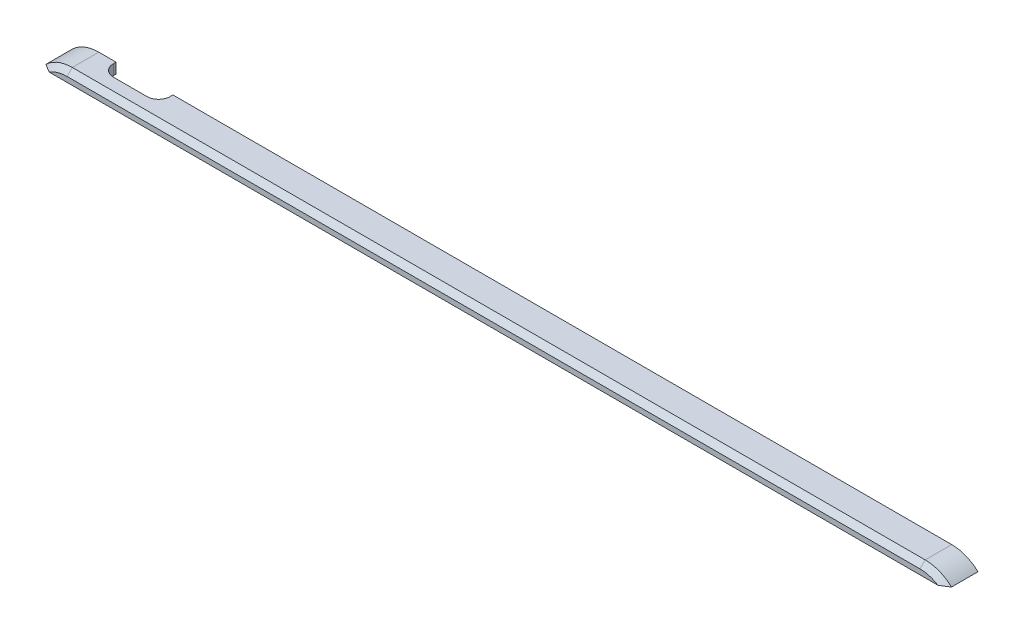
ISO-10303-21;
HEADER;
FILE_DESCRIPTION(('STEP AP214'),'2;1');
FILE_NAME('part.step','',(''),(''),'','','');
FILE_SCHEMA(('AUTOMOTIVE_DESIGN { 1 0 10303 214 1 1 1 1 }'));
ENDSEC;
DATA;
#1=APPLICATION_CONTEXT('core data for automotive mechanical design processes');
#2=APPLICATION_PROTOCOL_DEFINITION('international standard','automotive_design',2000,#1);
#3=PRODUCT_CONTEXT('',#1,'mechanical');
#4=PRODUCT('Part','Part','',(#3));
#5=PRODUCT_RELATED_PRODUCT_CATEGORY('part','',(#4));
#6=PRODUCT_DEFINITION_FORMATION('','',#4);
#7=PRODUCT_DEFINITION_CONTEXT('part definition',#1,'design');
#8=PRODUCT_DEFINITION('design','',#6,#7);
#9=PRODUCT_DEFINITION_SHAPE('','',#8);
#10=(LENGTH_UNIT() NAMED_UNIT(*) SI_UNIT(.MILLI.,.METRE.));
#11=(NAMED_UNIT(*) PLANE_ANGLE_UNIT() SI_UNIT($,.RADIAN.));
#12=(NAMED_UNIT(*) SI_UNIT($,.STERADIAN.) SOLID_ANGLE_UNIT());
#13=UNCERTAINTY_MEASURE_WITH_UNIT(LENGTH_MEASURE(1.E-05),#10,'distance_accuracy_value','');
#14=(GEOMETRIC_REPRESENTATION_CONTEXT(3) GLOBAL_UNCERTAINTY_ASSIGNED_CONTEXT((#13)) GLOBAL_UNIT_ASSIGNED_CONTEXT((#10,
#11,#12)) REPRESENTATION_CONTEXT('',''));
#15=CARTESIAN_POINT('',(0.,0.,0.));
#16=DIRECTION('',(0.,0.,1.));
#17=DIRECTION('',(1.,0.,0.));
#18=AXIS2_PLACEMENT_3D('',#15,#16,#17);
#19=CARTESIAN_POINT('',(149.811755103458,82.3491660064344,0.765));
#20=DIRECTION('',(0.,0.,1.));
#21=DIRECTION('',(1.,0.,0.));
#22=AXIS2_PLACEMENT_3D('',#19,#20,#21);
#23=PLANE('',#22);
#24=DIRECTION('',(0.,1.,0.));
#25=VECTOR('',#24,1.);
#26=CARTESIAN_POINT('',(146.86,82.3491660064344,0.765));
#27=LINE('',#26,#25);
#28=CARTESIAN_POINT('',(146.86,100.945,0.765));
#29=VERTEX_POINT('',#28);
#30=CARTESIAN_POINT('',(146.86,102.945000000004,0.765));
#31=VERTEX_POINT('',#30);
#32=EDGE_CURVE('E146',#29,#31,#27,.T.);
#33=ORIENTED_EDGE('',*,*,#32,.T.);
#34=DIRECTION('',(1.,1.50756392520579E-12,0.));
#35=VECTOR('',#34,1.);
#36=CARTESIAN_POINT('',(149.811755103476,102.945000000009,0.765));
#37=LINE('',#36,#35);
#38=CARTESIAN_POINT('',(153.3,102.945000000011,0.765));
#39=VERTEX_POINT('',#38);
#40=EDGE_CURVE('E150',#31,#39,#37,.T.);
#41=ORIENTED_EDGE('',*,*,#40,.T.);
#42=DIRECTION('',(0.,1.,0.));
#43=VECTOR('',#42,1.);
#44=CARTESIAN_POINT('',(153.3,82.3491660064344,0.765));
#45=LINE('',#44,#43);
#46=CARTESIAN_POINT('',(153.3,100.945000000002,0.765));
#47=VERTEX_POINT('',#46);
#48=EDGE_CURVE('E180',#47,#39,#45,.T.);
#49=ORIENTED_EDGE('',*,*,#48,.F.);
#50=DIRECTION('',(1.,3.05311352129674E-13,0.));
#51=VECTOR('',#50,1.);
#52=CARTESIAN_POINT('',(155.079999999998,100.945000000003,0.764999999999988));
#53=LINE('',#52,#51);
#54=EDGE_CURVE('E153',#29,#47,#53,.T.);
#55=ORIENTED_EDGE('',*,*,#54,.F.);
#56=EDGE_LOOP('',(#33,#41,#49,#55));
#57=FACE_BOUND('',#56,.T.);
#58=ADVANCED_FACE('F43',(#57),#23,.F.);
#59=CARTESIAN_POINT('',(305.329998695022,102.945000000001,2.9));
#60=DIRECTION('',(0.,1.,0.));
#61=DIRECTION('',(-1.,0.,0.));
#62=AXIS2_PLACEMENT_3D('',#59,#60,#61);
#63=PLANE('',#62);
#64=DIRECTION('',(0.,0.,1.));
#65=VECTOR('',#64,1.);
#66=CARTESIAN_POINT('',(141.29074746884,102.945000000001,2.9));
#67=LINE('',#66,#65);
#68=CARTESIAN_POINT('',(141.29074746884,102.945000000001,-2.));
#69=VERTEX_POINT('',#68);
#70=CARTESIAN_POINT('',(141.29074746884,102.945000000001,3.10000000000002));
#71=VERTEX_POINT('',#70);
#72=EDGE_CURVE('E196',#69,#71,#67,.T.);
#73=ORIENTED_EDGE('',*,*,#72,.T.);
#74=DIRECTION('',(1.,0.,0.));
#75=VECTOR('',#74,1.);
#76=CARTESIAN_POINT('',(305.329998695022,102.945000000001,3.10000000000002));
#77=LINE('',#76,#75);
#78=CARTESIAN_POINT('',(305.329998695022,102.945000000002,3.10000000000002));
#79=VERTEX_POINT('',#78);
#80=EDGE_CURVE('E211',#71,#79,#77,.T.);
#81=ORIENTED_EDGE('',*,*,#80,.T.);
#82=DIRECTION('',(0.,0.,1.));
#83=VECTOR('',#82,1.);
#84=CARTESIAN_POINT('',(305.329998695022,102.945000000002,2.9));
#85=LINE('',#84,#83);
#86=CARTESIAN_POINT('',(305.329998695022,102.945000000001,-2.));
#87=VERTEX_POINT('',#86);
#88=EDGE_CURVE('E195',#87,#79,#85,.T.);
#89=ORIENTED_EDGE('',*,*,#88,.F.);
#90=DIRECTION('',(-1.,0.,0.));
#91=VECTOR('',#90,1.);
#92=CARTESIAN_POINT('',(0.,102.945000000001,-2.));
#93=LINE('',#92,#91);
#94=CARTESIAN_POINT('',(155.55,102.945000000017,-2.));
#95=VERTEX_POINT('',#94);
#96=EDGE_CURVE('E192',#87,#95,#93,.T.);
#97=ORIENTED_EDGE('',*,*,#96,.T.);
#98=DIRECTION('',(0.,0.,-1.));
#99=VECTOR('',#98,1.);
#100=CARTESIAN_POINT('',(155.55,102.945000000017,-1.485));
#101=LINE('',#100,#99);
#102=CARTESIAN_POINT('',(155.55,102.945000000017,-1.485));
#103=VERTEX_POINT('',#102);
#104=EDGE_CURVE('E174',#103,#95,#101,.T.);
#105=ORIENTED_EDGE('',*,*,#104,.F.);
#106=CARTESIAN_POINT('',(153.3,102.945000000014,-1.485));
#107=DIRECTION('',(-1.50756392520579E-12,1.,0.));
#108=DIRECTION('',(-1.,-1.50756392520579E-12,0.));
#109=AXIS2_PLACEMENT_3D('',#106,#107,#108);
#110=CIRCLE('',#109,2.25);
#111=EDGE_CURVE('E172',#39,#103,#110,.T.);
#112=ORIENTED_EDGE('',*,*,#111,.F.);
#113=ORIENTED_EDGE('',*,*,#40,.F.);
#114=CARTESIAN_POINT('',(146.86,102.945000000004,-1.485));
#115=DIRECTION('',(-1.50756392520579E-12,1.,0.));
#116=DIRECTION('',(-1.,-1.50756392520579E-12,0.));
#117=AXIS2_PLACEMENT_3D('',#114,#115,#116);
#118=CIRCLE('',#117,2.25);
#119=CARTESIAN_POINT('',(144.61,102.945000000001,-1.485));
#120=VERTEX_POINT('',#119);
#121=EDGE_CURVE('E160',#120,#31,#118,.T.);
#122=ORIENTED_EDGE('',*,*,#121,.F.);
#123=DIRECTION('',(0.,0.,1.));
#124=VECTOR('',#123,1.);
#125=CARTESIAN_POINT('',(144.61,102.945000000001,-2.145));
#126=LINE('',#125,#124);
#127=CARTESIAN_POINT('',(144.61,102.945000000001,-2.));
#128=VERTEX_POINT('',#127);
#129=EDGE_CURVE('E178',#128,#120,#126,.T.);
#130=ORIENTED_EDGE('',*,*,#129,.F.);
#131=EDGE_CURVE('E191',#128,#69,#93,.T.);
#132=ORIENTED_EDGE('',*,*,#131,.T.);
#133=EDGE_LOOP('',(#73,#81,#89,#97,#105,#112,#113,#122,#130,#132));
#134=FACE_BOUND('',#133,.T.);
#135=ADVANCED_FACE('F169',(#134),#63,.T.);
#136=CARTESIAN_POINT('',(0.,0.,-2.));
#137=DIRECTION('',(0.,0.,-1.));
#138=DIRECTION('',(-1.,0.,0.));
#139=AXIS2_PLACEMENT_3D('',#136,#137,#138);
#140=PLANE('',#139);
#141=DIRECTION('',(1.,0.,0.));
#142=VECTOR('',#141,1.);
#143=CARTESIAN_POINT('',(0.,100.945000000001,-2.));
#144=LINE('',#143,#142);
#145=CARTESIAN_POINT('',(136.231103891899,100.945000000001,-2.));
#146=VERTEX_POINT('',#145);
#147=CARTESIAN_POINT('',(144.61,100.945000000001,-2.));
#148=VERTEX_POINT('',#147);
#149=EDGE_CURVE('E266',#146,#148,#144,.T.);
#150=ORIENTED_EDGE('',*,*,#149,.F.);
#151=CARTESIAN_POINT('',(141.29074693768,95.545003062316,-2.));
#152=DIRECTION('',(0.,0.,-1.));
#153=DIRECTION('',(-1.,0.,0.));
#154=AXIS2_PLACEMENT_3D('',#151,#152,#153);
#155=CIRCLE('',#154,7.39999693768338);
#156=EDGE_CURVE('E189',#69,#146,#155,.F.);
#157=ORIENTED_EDGE('',*,*,#156,.F.);
#158=ORIENTED_EDGE('',*,*,#131,.F.);
#159=DIRECTION('',(0.,1.,0.));
#160=VECTOR('',#159,1.);
#161=CARTESIAN_POINT('',(144.61,0.,-2.));
#162=LINE('',#161,#160);
#163=EDGE_CURVE('E182',#148,#128,#162,.T.);
#164=ORIENTED_EDGE('',*,*,#163,.F.);
#165=EDGE_LOOP('',(#150,#157,#158,#164));
#166=FACE_BOUND('',#165,.T.);
#167=ADVANCED_FACE('F303',(#166),#140,.T.);
#168=CARTESIAN_POINT('',(146.86,82.3491660064344,-1.485));
#169=DIRECTION('',(0.,1.,0.));
#170=DIRECTION('',(0.,0.,1.));
#171=AXIS2_PLACEMENT_3D('',#168,#169,#170);
#172=CYLINDRICAL_SURFACE('',#171,2.25);
#173=CARTESIAN_POINT('',(146.86,100.945000000001,-1.485));
#174=DIRECTION('',(-3.05311352129674E-13,1.,0.));
#175=DIRECTION('',(-1.,-3.05311352129674E-13,0.));
#176=AXIS2_PLACEMENT_3D('',#173,#174,#175);
#177=CIRCLE('',#176,2.25);
#178=CARTESIAN_POINT('',(144.61,100.945000000001,-1.485));
#179=VERTEX_POINT('',#178);
#180=EDGE_CURVE('E166',#179,#29,#177,.T.);
#181=ORIENTED_EDGE('',*,*,#180,.F.);
#182=DIRECTION('',(0.,1.,0.));
#183=VECTOR('',#182,1.);
#184=CARTESIAN_POINT('',(144.61,82.3491660064344,-1.485));
#185=LINE('',#184,#183);
#186=EDGE_CURVE('E156',#179,#120,#185,.T.);
#187=ORIENTED_EDGE('',*,*,#186,.T.);
#188=ORIENTED_EDGE('',*,*,#121,.T.);
#189=ORIENTED_EDGE('',*,*,#32,.F.);
#190=EDGE_LOOP('',(#181,#187,#188,#189));
#191=FACE_BOUND('',#190,.T.);
#192=ADVANCED_FACE('F161',(#191),#172,.F.);
#193=CARTESIAN_POINT('',(144.61,82.3491660064344,-2.145));
#194=DIRECTION('',(-1.,0.,0.));
#195=DIRECTION('',(0.,0.,1.));
#196=AXIS2_PLACEMENT_3D('',#193,#194,#195);
#197=PLANE('',#196);
#198=ORIENTED_EDGE('',*,*,#186,.F.);
#199=DIRECTION('',(0.,0.,-1.));
#200=VECTOR('',#199,1.);
#201=CARTESIAN_POINT('',(144.61,100.945000000001,-2.145));
#202=LINE('',#201,#200);
#203=EDGE_CURVE('E260',#179,#148,#202,.T.);
#204=ORIENTED_EDGE('',*,*,#203,.T.);
#205=ORIENTED_EDGE('',*,*,#163,.T.);
#206=ORIENTED_EDGE('',*,*,#129,.T.);
#207=EDGE_LOOP('',(#198,#204,#205,#206));
#208=FACE_BOUND('',#207,.T.);
#209=ADVANCED_FACE('F291',(#208),#197,.F.);
#210=CARTESIAN_POINT('',(153.3,82.3491660064344,-1.485));
#211=DIRECTION('',(0.,1.,0.));
#212=DIRECTION('',(0.,0.,1.));
#213=AXIS2_PLACEMENT_3D('',#210,#211,#212);
#214=CYLINDRICAL_SURFACE('',#213,2.25);
#215=DIRECTION('',(0.,1.,0.));
#216=VECTOR('',#215,1.);
#217=CARTESIAN_POINT('',(155.55,82.3491660064344,-1.485));
#218=LINE('',#217,#216);
#219=CARTESIAN_POINT('',(155.55,100.945000000001,-1.485));
#220=VERTEX_POINT('',#219);
#221=EDGE_CURVE('E335',#220,#103,#218,.T.);
#222=ORIENTED_EDGE('',*,*,#221,.F.);
#223=CARTESIAN_POINT('',(153.3,100.945000000003,-1.485));
#224=DIRECTION('',(-3.05311352129674E-13,1.,0.));
#225=DIRECTION('',(-1.,-3.05311352129674E-13,0.));
#226=AXIS2_PLACEMENT_3D('',#223,#224,#225);
#227=CIRCLE('',#226,2.25);
#228=EDGE_CURVE('E201',#47,#220,#227,.T.);
#229=ORIENTED_EDGE('',*,*,#228,.F.);
#230=ORIENTED_EDGE('',*,*,#48,.T.);
#231=ORIENTED_EDGE('',*,*,#111,.T.);
#232=EDGE_LOOP('',(#222,#229,#230,#231));
#233=FACE_BOUND('',#232,.T.);
#234=ADVANCED_FACE('F284',(#233),#214,.F.);
#235=CARTESIAN_POINT('',(223.310489012841,99.9450000000011,1.00857997860453));
#236=DIRECTION('',(0.,0.,-1.));
#237=DIRECTION('',(-1.,0.,0.));
#238=AXIS2_PLACEMENT_3D('',#235,#236,#237);
#239=CONICAL_SURFACE('',#238,1.65000000000001,1.02974425867666);
#240=CARTESIAN_POINT('',(223.310489012841,99.9450000000011,1.00857997860453));
#241=DIRECTION('',(0.,0.,-1.));
#242=DIRECTION('',(-1.,0.,0.));
#243=AXIS2_PLACEMENT_3D('',#240,#241,#242);
#244=CIRCLE('',#243,1.65000000000001);
#245=CARTESIAN_POINT('',(221.998048538001,100.945000000001,1.00857997860453));
#246=VERTEX_POINT('',#245);
#247=CARTESIAN_POINT('',(224.622929487682,100.945000000001,1.00857997860453));
#248=VERTEX_POINT('',#247);
#249=EDGE_CURVE('E157',#246,#248,#244,.T.);
#250=ORIENTED_EDGE('',*,*,#249,.T.);
#251=CARTESIAN_POINT('',(214.694187991071,100.945000000001,-3.21194700188258));
#252=CARTESIAN_POINT('',(214.970886690454,100.945000000001,-3.04680463875739));
#253=CARTESIAN_POINT('',(215.247626545812,100.945000000001,-2.88173113505485));
#254=CARTESIAN_POINT('',(215.801267148884,100.945000000001,-2.55177695549593));
#255=CARTESIAN_POINT('',(216.078167912161,100.945000000001,-2.38689630575886));
#256=CARTESIAN_POINT('',(216.632891741382,100.945000000001,-2.05697702486592));
#257=CARTESIAN_POINT('',(216.910715273147,100.945000000001,-1.89193917651968));
#258=CARTESIAN_POINT('',(217.466582232382,100.945000000001,-1.56231046001289));
#259=CARTESIAN_POINT('',(217.744625629426,100.945000000001,-1.39771954053712));
#260=CARTESIAN_POINT('',(218.35013173903,100.945000000001,-1.04022112088084));
#261=CARTESIAN_POINT('',(218.67766687962,100.945000000001,-0.847436033685756));
#262=CARTESIAN_POINT('',(219.169748414202,100.945000000001,-0.559439899633264));
#263=CARTESIAN_POINT('',(219.333937895368,100.945000000001,-0.463619299709885));
#264=CARTESIAN_POINT('',(219.662652374727,100.945000000001,-0.272568574002124));
#265=CARTESIAN_POINT('',(219.827177360271,100.945000000001,-0.177338426481848));
#266=CARTESIAN_POINT('',(220.156417439291,100.945000000001,0.0120758789763789));
#267=CARTESIAN_POINT('',(220.321131595,100.945000000001,0.106261665829728));
#268=CARTESIAN_POINT('',(220.651346503488,100.945000000001,0.293306929038242));
#269=CARTESIAN_POINT('',(220.816847366243,100.945000000001,0.386166212227427));
#270=CARTESIAN_POINT('',(221.065992469824,100.945000000001,0.523702127512906));
#271=CARTESIAN_POINT('',(221.149160846966,100.945000000001,0.569239796067037));
#272=CARTESIAN_POINT('',(221.315921664274,100.945000000001,0.659530870143676));
#273=CARTESIAN_POINT('',(221.399514097407,100.945000000001,0.704284288618714));
#274=CARTESIAN_POINT('',(221.567252170647,100.945000000001,0.792695696160076));
#275=CARTESIAN_POINT('',(221.651397675227,100.945000000001,0.836353941824392));
#276=CARTESIAN_POINT('',(221.820474859997,100.945000000001,0.922116582190598));
#277=CARTESIAN_POINT('',(221.90540647142,100.945000000001,0.964221111231647));
#278=CARTESIAN_POINT('',(222.026543176841,100.945000000001,1.02222791028813));
#279=CARTESIAN_POINT('',(222.062286488905,100.945000000001,1.03909431129302));
#280=CARTESIAN_POINT('',(222.134002238529,100.945000000001,1.07233679807991));
#281=CARTESIAN_POINT('',(222.169974683346,100.945000000001,1.08871286823364));
#282=CARTESIAN_POINT('',(222.242193868846,100.945000000001,1.12087983781569));
#283=CARTESIAN_POINT('',(222.278440686143,100.945000000001,1.13667056594312));
#284=CARTESIAN_POINT('',(222.35123894946,100.945000000001,1.167532006739));
#285=CARTESIAN_POINT('',(222.387790394306,100.945000000001,1.18260272217775));
#286=CARTESIAN_POINT('',(222.497260608641,100.945000000001,1.2262284003639));
#287=CARTESIAN_POINT('',(222.570695060313,100.945000000001,1.25351477686742));
#288=CARTESIAN_POINT('',(222.719289617091,100.945000000001,1.30297548277343));
#289=CARTESIAN_POINT('',(222.794448884473,100.945000000001,1.32515223840304));
#290=CARTESIAN_POINT('',(222.923062443324,100.945000000001,1.35626622663656));
#291=CARTESIAN_POINT('',(222.976031220133,100.945000000001,1.36717670186032));
#292=CARTESIAN_POINT('',(223.082694533336,100.945000000001,1.38451781195559));
#293=CARTESIAN_POINT('',(223.136388714203,100.945000000001,1.39095056561359));
#294=CARTESIAN_POINT('',(223.243901790447,100.945000000001,1.39865745903534));
#295=CARTESIAN_POINT('',(223.297718871007,100.945000000001,1.39995604486939));
#296=CARTESIAN_POINT('',(223.405227639647,100.945000000001,1.39731387036754));
#297=CARTESIAN_POINT('',(223.458919300861,100.945000000001,1.39337207511463));
#298=CARTESIAN_POINT('',(223.58416122155,100.945000000001,1.37848210940148));
#299=CARTESIAN_POINT('',(223.655476478806,100.945000000001,1.36558466903972));
#300=CARTESIAN_POINT('',(223.796553533905,100.945000000001,1.33307727023198));
#301=CARTESIAN_POINT('',(223.866313706805,100.945000000001,1.31346061150743));
#302=CARTESIAN_POINT('',(224.005910385357,100.945000000001,1.26901574456081));
#303=CARTESIAN_POINT('',(224.075710793637,100.945000000001,1.24407675174826));
#304=CARTESIAN_POINT('',(224.179406605398,100.945000000001,1.20415560008459));
#305=CARTESIAN_POINT('',(224.213799383491,100.945000000001,1.19043199375118));
#306=CARTESIAN_POINT('',(224.282295449047,100.945000000001,1.16228223227698));
#307=CARTESIAN_POINT('',(224.316398747383,100.945000000001,1.14785610365813));
#308=CARTESIAN_POINT('',(224.432957768475,100.945000000001,1.09738004959701));
#309=CARTESIAN_POINT('',(224.51479999325,100.945000000001,1.05991592201944));
#310=CARTESIAN_POINT('',(224.677438596456,100.945000000001,0.982773727446175));
#311=CARTESIAN_POINT('',(224.758234766822,100.945000000001,0.943095228089168));
#312=CARTESIAN_POINT('',(224.919110653249,100.945000000001,0.862209920285997));
#313=CARTESIAN_POINT('',(224.999189958218,100.945000000001,0.821002296930696));
#314=CARTESIAN_POINT('',(225.158792283646,100.945000000001,0.737521346018975));
#315=CARTESIAN_POINT('',(225.238315284432,100.945000000001,0.695247981017635));
#316=CARTESIAN_POINT('',(225.476589240269,100.945000000001,0.567113754658055));
#317=CARTESIAN_POINT('',(225.634721645887,100.945000000001,0.480104793786229));
#318=CARTESIAN_POINT('',(225.949968565067,100.945000000001,0.304395983185692));
#319=CARTESIAN_POINT('',(226.107083397597,100.945000000001,0.215696701469319));
#320=CARTESIAN_POINT('',(226.397633341943,100.945000000001,0.0503365205529457));
#321=CARTESIAN_POINT('',(226.531152760848,100.945000000001,-0.0261763718179388));
#322=CARTESIAN_POINT('',(226.797885026475,100.945000000001,-0.179764945916014));
#323=CARTESIAN_POINT('',(226.931097840904,100.945000000001,-0.256840683652189));
#324=CARTESIAN_POINT('',(227.196805313119,100.945000000001,-0.411112588253136));
#325=CARTESIAN_POINT('',(227.329300819586,100.945000000001,-0.488307294466906));
#326=CARTESIAN_POINT('',(227.594099063033,100.945000000001,-0.642993446395089));
#327=CARTESIAN_POINT('',(227.726401819557,100.945000000001,-0.720484858644653));
#328=CARTESIAN_POINT('',(227.858642226062,100.945000000001,-0.798082015417644));
#329=B_SPLINE_CURVE_WITH_KNOTS('',3,(#251,#252,#253,#254,#255,#256,#257,#258,#259,#260,#261,
#262,#263,#264,#265,#266,#267,#268,#269,#270,#271,#272,#273,#274,#275,#276,#277,#278,#279,#280,
#281,#282,#283,#284,#285,#286,#287,#288,#289,#290,#291,#292,#293,#294,#295,#296,#297,#298,#299,
#300,#301,#302,#303,#304,#305,#306,#307,#308,#309,#310,#311,#312,#313,#314,#315,#316,#317,#318,
#319,#320,#321,#322,#323,#324,#325,#326,#327,#328),.UNSPECIFIED.,.F.,.F.,(4,2,2,2,2,2,2,2,2,2,2,
2,2,2,2,2,2,2,2,2,2,2,2,2,2,2,2,2,2,2,2,2,2,2,2,2,2,2,4),(0.,0.966699356322777,1.93351721938047,
2.90295521050736,3.87227674022051,5.01245253688786,5.58276571622721,6.15305777488708,
6.72227848313687,7.29158125347397,7.57603567184666,7.86048538778627,8.14486782286904,
8.42922561147442,8.54779138509503,8.66636093373519,8.78496491223668,8.90356843436625,
9.13847158500371,9.37326296445707,9.53535161661302,9.69736351876831,9.85860307402816,
10.0198744770387,10.236831277935,10.4540050569797,10.6762392466034,10.7873234005024,
10.8984033639492,11.1683719975873,11.4383935289232,11.7085610886557,11.9787381540134,
12.5201829272061,13.0614488552324,13.5231122245766,13.9848221778653,14.4448507847009,
14.9048289505118),.UNSPECIFIED.);
#330=EDGE_CURVE('E262',#248,#246,#329,.F.);
#331=ORIENTED_EDGE('',*,*,#330,.T.);
#332=EDGE_LOOP('',(#250,#331));
#333=FACE_BOUND('',#332,.T.);
#334=ADVANCED_FACE('F278',(#333),#239,.F.);
#335=DIRECTION('',(1.,0.,0.));
#336=VECTOR('',#335,1.);
#337=CARTESIAN_POINT('',(0.,100.945000000001,-2.));
#338=LINE('',#337,#336);
#339=CARTESIAN_POINT('',(155.55,100.945000000001,-2.));
#340=VERTEX_POINT('',#339);
#341=CARTESIAN_POINT('',(221.998048538001,100.945000000001,-2.));
#342=VERTEX_POINT('',#341);
#343=EDGE_CURVE('E270',#340,#342,#338,.T.);
#344=ORIENTED_EDGE('',*,*,#343,.F.);
#345=DIRECTION('',(0.,-1.,0.));
#346=VECTOR('',#345,1.);
#347=CARTESIAN_POINT('',(155.55,0.,-2.));
#348=LINE('',#347,#346);
#349=EDGE_CURVE('E184',#95,#340,#348,.T.);
#350=ORIENTED_EDGE('',*,*,#349,.F.);
#351=ORIENTED_EDGE('',*,*,#96,.F.);
#352=CARTESIAN_POINT('',(305.33000306231,95.545003062316,-2.));
#353=DIRECTION('',(0.,0.,-1.));
#354=DIRECTION('',(-1.,0.,0.));
#355=AXIS2_PLACEMENT_3D('',#352,#353,#354);
#356=CIRCLE('',#355,7.39999693768695);
#357=CARTESIAN_POINT('',(310.389646108096,100.945000000001,-2.));
#358=VERTEX_POINT('',#357);
#359=EDGE_CURVE('E187',#358,#87,#356,.F.);
#360=ORIENTED_EDGE('',*,*,#359,.F.);
#361=CARTESIAN_POINT('',(224.622929487682,100.945000000001,-2.));
#362=VERTEX_POINT('',#361);
#363=EDGE_CURVE('E267',#362,#358,#338,.T.);
#364=ORIENTED_EDGE('',*,*,#363,.F.);
#365=CARTESIAN_POINT('',(223.310489012841,99.9450000000011,-2.));
#366=DIRECTION('',(0.,0.,-1.));
#367=DIRECTION('',(-1.,0.,0.));
#368=AXIS2_PLACEMENT_3D('',#365,#366,#367);
#369=CIRCLE('',#368,1.64999999999998);
#370=EDGE_CURVE('E223',#342,#362,#369,.T.);
#371=ORIENTED_EDGE('',*,*,#370,.F.);
#372=EDGE_LOOP('',(#344,#350,#351,#360,#364,#371));
#373=FACE_BOUND('',#372,.T.);
#374=ADVANCED_FACE('F283',(#373),#140,.T.);
#375=CARTESIAN_POINT('',(223.310489012841,99.9450000000011,-2.));
#376=DIRECTION('',(0.,0.,-1.));
#377=DIRECTION('',(-1.,0.,0.));
#378=AXIS2_PLACEMENT_3D('',#375,#376,#377);
#379=CYLINDRICAL_SURFACE('',#378,1.65);
#380=ORIENTED_EDGE('',*,*,#370,.T.);
#381=DIRECTION('',(0.,0.,-1.));
#382=VECTOR('',#381,1.);
#383=CARTESIAN_POINT('',(224.622929487682,100.945000000001,-2.));
#384=LINE('',#383,#382);
#385=EDGE_CURVE('E271',#362,#248,#384,.F.);
#386=ORIENTED_EDGE('',*,*,#385,.T.);
#387=ORIENTED_EDGE('',*,*,#249,.F.);
#388=DIRECTION('',(0.,0.,-1.));
#389=VECTOR('',#388,1.);
#390=CARTESIAN_POINT('',(221.998048538001,100.945000000001,-2.));
#391=LINE('',#390,#389);
#392=EDGE_CURVE('E219',#246,#342,#391,.T.);
#393=ORIENTED_EDGE('',*,*,#392,.T.);
#394=EDGE_LOOP('',(#380,#386,#387,#393));
#395=FACE_BOUND('',#394,.T.);
#396=ADVANCED_FACE('F286',(#395),#379,.F.);
#397=CARTESIAN_POINT('',(155.55,82.3491660064344,-1.485));
#398=DIRECTION('',(1.,0.,0.));
#399=DIRECTION('',(0.,0.,-1.));
#400=AXIS2_PLACEMENT_3D('',#397,#398,#399);
#401=PLANE('',#400);
#402=ORIENTED_EDGE('',*,*,#349,.T.);
#403=DIRECTION('',(0.,0.,1.));
#404=VECTOR('',#403,1.);
#405=CARTESIAN_POINT('',(155.55,100.945000000001,-1.485));
#406=LINE('',#405,#404);
#407=EDGE_CURVE('E47',#340,#220,#406,.T.);
#408=ORIENTED_EDGE('',*,*,#407,.T.);
#409=ORIENTED_EDGE('',*,*,#221,.T.);
#410=ORIENTED_EDGE('',*,*,#104,.T.);
#411=EDGE_LOOP('',(#402,#408,#409,#410));
#412=FACE_BOUND('',#411,.T.);
#413=ADVANCED_FACE('F293',(#412),#401,.F.);
#414=CARTESIAN_POINT('',(141.29074693768,95.545003062316,2.9));
#415=DIRECTION('',(0.,0.,1.));
#416=DIRECTION('',(1.,0.,0.));
#417=AXIS2_PLACEMENT_3D('',#414,#415,#416);
#418=CYLINDRICAL_SURFACE('',#417,7.39999693768338);
#419=DIRECTION('',(0.,0.,1.));
#420=VECTOR('',#419,1.);
#421=CARTESIAN_POINT('',(136.231103891899,100.945000000001,2.9));
#422=LINE('',#421,#420);
#423=CARTESIAN_POINT('',(136.231103891899,100.945000000001,3.10000000000002));
#424=VERTEX_POINT('',#423);
#425=EDGE_CURVE('E66',#424,#146,#422,.F.);
#426=ORIENTED_EDGE('',*,*,#425,.F.);
#427=CARTESIAN_POINT('',(141.29074693768,95.545003062316,3.10000000000002));
#428=DIRECTION('',(0.,0.,1.));
#429=DIRECTION('',(1.,0.,0.));
#430=AXIS2_PLACEMENT_3D('',#427,#428,#429);
#431=CIRCLE('',#430,7.39999693768338);
#432=EDGE_CURVE('E214',#424,#71,#431,.F.);
#433=ORIENTED_EDGE('',*,*,#432,.T.);
#434=ORIENTED_EDGE('',*,*,#72,.F.);
#435=ORIENTED_EDGE('',*,*,#156,.T.);
#436=EDGE_LOOP('',(#426,#433,#434,#435));
#437=FACE_BOUND('',#436,.T.);
#438=ADVANCED_FACE('F296',(#437),#418,.T.);
#439=CARTESIAN_POINT('',(141.29074693768,101.945000000001,4.1));
#440=DIRECTION('',(0.,-0.70710678118654,-0.707106781186555));
#441=DIRECTION('',(-1.,0.,0.));
#442=AXIS2_PLACEMENT_3D('',#439,#440,#441);
#443=PLANE('',#442);
#444=DIRECTION('',(0.,0.707106781186621,-0.707106781186474));
#445=VECTOR('',#444,1.);
#446=CARTESIAN_POINT('',(305.329998695022,101.945000000001,4.1));
#447=LINE('',#446,#445);
#448=CARTESIAN_POINT('',(305.329998695022,101.945000000001,4.1));
#449=VERTEX_POINT('',#448);
#450=EDGE_CURVE('E222',#449,#79,#447,.T.);
#451=ORIENTED_EDGE('',*,*,#450,.T.);
#452=ORIENTED_EDGE('',*,*,#80,.F.);
#453=DIRECTION('',(0.,-0.707106781186552,0.707106781186543));
#454=VECTOR('',#453,1.);
#455=CARTESIAN_POINT('',(141.29074746884,102.944999999999,3.10000000000002));
#456=LINE('',#455,#454);
#457=CARTESIAN_POINT('',(141.29074746884,101.944999999999,4.1));
#458=VERTEX_POINT('',#457);
#459=EDGE_CURVE('E220',#71,#458,#456,.T.);
#460=ORIENTED_EDGE('',*,*,#459,.T.);
#461=DIRECTION('',(-1.,0.,0.));
#462=VECTOR('',#461,1.);
#463=CARTESIAN_POINT('',(141.29074693768,101.945000000001,4.1));
#464=LINE('',#463,#462);
#465=EDGE_CURVE('E208',#449,#458,#464,.T.);
#466=ORIENTED_EDGE('',*,*,#465,.F.);
#467=EDGE_LOOP('',(#451,#452,#460,#466));
#468=FACE_BOUND('',#467,.T.);
#469=ADVANCED_FACE('F242',(#468),#443,.F.);
#470=CARTESIAN_POINT('',(141.29074693768,95.545003062316,4.1));
#471=DIRECTION('',(0.,0.,1.));
#472=DIRECTION('',(1.,0.,0.));
#473=AXIS2_PLACEMENT_3D('',#470,#471,#472);
#474=PLANE('',#473);
#475=DIRECTION('',(-1.,0.,0.));
#476=VECTOR('',#475,1.);
#477=CARTESIAN_POINT('',(141.29074693768,100.945000000001,4.1));
#478=LINE('',#477,#476);
#479=CARTESIAN_POINT('',(308.765114978303,100.945000000001,4.1));
#480=VERTEX_POINT('',#479);
#481=CARTESIAN_POINT('',(137.855635021694,100.945000000001,4.1));
#482=VERTEX_POINT('',#481);
#483=EDGE_CURVE('E259',#480,#482,#478,.T.);
#484=ORIENTED_EDGE('',*,*,#483,.F.);
#485=CARTESIAN_POINT('',(305.33000306231,95.545003062316,4.1));
#486=DIRECTION('',(0.,0.,1.));
#487=DIRECTION('',(1.,0.,0.));
#488=AXIS2_PLACEMENT_3D('',#485,#486,#487);
#489=CIRCLE('',#488,6.39999693768697);
#490=EDGE_CURVE('E203',#480,#449,#489,.T.);
#491=ORIENTED_EDGE('',*,*,#490,.T.);
#492=ORIENTED_EDGE('',*,*,#465,.T.);
#493=CARTESIAN_POINT('',(141.29074693768,95.545003062316,4.1));
#494=DIRECTION('',(0.,0.,1.));
#495=DIRECTION('',(1.,0.,0.));
#496=AXIS2_PLACEMENT_3D('',#493,#494,#495);
#497=CIRCLE('',#496,6.3999969376834);
#498=EDGE_CURVE('E205',#458,#482,#497,.T.);
#499=ORIENTED_EDGE('',*,*,#498,.T.);
#500=EDGE_LOOP('',(#484,#491,#492,#499));
#501=FACE_BOUND('',#500,.T.);
#502=ADVANCED_FACE('F241',(#501),#474,.T.);
#503=CARTESIAN_POINT('',(141.29074693768,95.545003062316,4.1));
#504=DIRECTION('',(0.,0.,-1.));
#505=DIRECTION('',(-1.,0.,0.));
#506=AXIS2_PLACEMENT_3D('',#503,#504,#505);
#507=CONICAL_SURFACE('',#506,6.3999969376834,0.785398163397455);
#508=CARTESIAN_POINT('',(145.771303092448,100.945000000001,3.48320633349407));
#509=CARTESIAN_POINT('',(145.663385284355,100.945000000001,3.55210626497247));
#510=CARTESIAN_POINT('',(145.554801705982,100.945000000001,3.61997786549331));
#511=CARTESIAN_POINT('',(145.33613746665,100.945000000001,3.75332349725623));
#512=CARTESIAN_POINT('',(145.226056446579,100.945000000001,3.81879693896409));
#513=CARTESIAN_POINT('',(145.003782104916,100.945000000001,3.94726162303721));
#514=CARTESIAN_POINT('',(144.89158147422,100.945000000001,4.01024027928303));
#515=CARTESIAN_POINT('',(144.665426193835,100.945000000001,4.13293982368767));
#516=CARTESIAN_POINT('',(144.551471654271,100.945000000001,4.19266091532257));
#517=CARTESIAN_POINT('',(144.200972101535,100.945000000001,4.36910536813389));
#518=CARTESIAN_POINT('',(143.961345110213,100.945000000001,4.47983676872201));
#519=CARTESIAN_POINT('',(143.473539138781,100.945000000001,4.67974895786071));
#520=CARTESIAN_POINT('',(143.22537663275,100.945000000001,4.76896886131019));
#521=CARTESIAN_POINT('',(142.814334737116,100.945000000001,4.89122260769448));
#522=CARTESIAN_POINT('',(142.654005834288,100.945000000001,4.93281779282761));
#523=CARTESIAN_POINT('',(142.330487638743,100.945000000001,5.00307762072945));
#524=CARTESIAN_POINT('',(142.167298302972,100.945000000001,5.03174206869159));
#525=CARTESIAN_POINT('',(141.840657389872,100.945000000001,5.07446192220419));
#526=CARTESIAN_POINT('',(141.67722485878,100.945000000001,5.08866096865344));
#527=CARTESIAN_POINT('',(141.349743194422,100.945000000001,5.10215555827083));
#528=CARTESIAN_POINT('',(141.185694094555,100.945000000001,5.10145189741545));
#529=CARTESIAN_POINT('',(140.857989272035,100.945000000001,5.08516564643141));
#530=CARTESIAN_POINT('',(140.694335190718,100.945000000001,5.06955056798978));
#531=CARTESIAN_POINT('',(140.368997574628,100.945000000001,5.02426703613491));
#532=CARTESIAN_POINT('',(140.207314241618,100.945000000001,4.99459715600649));
#533=CARTESIAN_POINT('',(139.885942967893,100.945000000001,4.92247343734122));
#534=CARTESIAN_POINT('',(139.726270569474,100.945000000001,4.87995125585858));
#535=CARTESIAN_POINT('',(139.410305596669,100.945000000001,4.78393545141524));
#536=CARTESIAN_POINT('',(139.254012968022,100.945000000001,4.7304420047364));
#537=CARTESIAN_POINT('',(138.906285070063,100.945000000001,4.59969545273862));
#538=CARTESIAN_POINT('',(138.715831753681,100.945000000001,4.51984572621876));
#539=CARTESIAN_POINT('',(138.340091174145,100.945000000001,4.34870957070566));
#540=CARTESIAN_POINT('',(138.154806596691,100.945000000001,4.25741732663571));
#541=CARTESIAN_POINT('',(137.78861661946,100.945000000001,4.06567433620687));
#542=CARTESIAN_POINT('',(137.607720420057,100.945000000001,3.96520615310654));
#543=CARTESIAN_POINT('',(137.250116136245,100.945000000001,3.7571843961519));
#544=CARTESIAN_POINT('',(137.073407377539,100.945000000001,3.64963197374989));
#545=CARTESIAN_POINT('',(136.72202310926,100.945000000001,3.42790607519892));
#546=CARTESIAN_POINT('',(136.547379372333,100.945000000001,3.31368248309822));
#547=CARTESIAN_POINT('',(136.201200027133,100.945000000001,3.08062500654541));
#548=CARTESIAN_POINT('',(136.029664512793,100.945000000001,2.96179098310122));
#549=CARTESIAN_POINT('',(135.689439154961,100.945000000001,2.72052066965132));
#550=CARTESIAN_POINT('',(135.520746368339,100.945000000001,2.59808851796419));
#551=CARTESIAN_POINT('',(135.185621850501,100.945000000001,2.35016161828813));
#552=CARTESIAN_POINT('',(135.019190206957,100.945000000001,2.22466675207076));
#553=CARTESIAN_POINT('',(134.672427099807,100.945000000001,1.95900527303908));
#554=CARTESIAN_POINT('',(134.492290682711,100.945000000001,1.81858443660632));
#555=CARTESIAN_POINT('',(134.134000513503,100.945000000001,1.5352328125021));
#556=CARTESIAN_POINT('',(133.95584680709,100.945000000001,1.39230196717261));
#557=CARTESIAN_POINT('',(133.423800037673,100.945000000001,0.960303114346675));
#558=CARTESIAN_POINT('',(133.072437494771,100.945000000001,0.66811868529558));
#559=CARTESIAN_POINT('',(132.383560745264,100.945000000001,0.0853337874712217));
#560=CARTESIAN_POINT('',(132.045921204734,100.945000000001,-0.205119311143903));
#561=CARTESIAN_POINT('',(131.542300883392,100.945000000001,-0.643853991807174));
#562=CARTESIAN_POINT('',(131.374948533048,100.945000000001,-0.790565243678142));
#563=CARTESIAN_POINT('',(131.041056171273,100.945000000001,-1.08490418148801));
#564=CARTESIAN_POINT('',(130.874516147106,100.945000000001,-1.23253185297582));
#565=CARTESIAN_POINT('',(130.708329338917,100.945000000001,-1.38055562360842));
#566=B_SPLINE_CURVE_WITH_KNOTS('',3,(#508,#509,#510,#511,#512,#513,#514,#515,#516,#517,#518,
#519,#520,#521,#522,#523,#524,#525,#526,#527,#528,#529,#530,#531,#532,#533,#534,#535,#536,#537,
#538,#539,#540,#541,#542,#543,#544,#545,#546,#547,#548,#549,#550,#551,#552,#553,#554,#555,#556,
#557,#558,#559,#560,#561,#562,#563,#564,#565),.UNSPECIFIED.,.F.,.F.,(4,2,2,2,2,2,2,2,2,2,2,2,2,
2,2,2,2,2,2,2,2,2,2,2,2,2,2,2,4),(0.,0.384115954275871,0.768325709728086,1.15427570830493,
1.54020157175508,2.33135997183906,3.12106875208325,3.61753067375805,4.11400007457435,
4.60549003330919,5.09695374087655,5.58949067593111,6.08207761955712,6.57733143919518,
7.07257730191841,7.69162684258641,8.31099226901373,8.93156016726604,9.55202744787876,
10.1779784215617,10.8039482806654,11.4292243839662,12.0545246627878,12.7397008727504,
13.4248928427039,14.795717328315,16.1318163675803,16.7994803290776,17.4671337887521),.UNSPECIFIED.);
#567=EDGE_CURVE('E11',#482,#424,#566,.T.);
#568=ORIENTED_EDGE('',*,*,#567,.F.);
#569=ORIENTED_EDGE('',*,*,#498,.F.);
#570=ORIENTED_EDGE('',*,*,#459,.F.);
#571=ORIENTED_EDGE('',*,*,#432,.F.);
#572=EDGE_LOOP('',(#568,#569,#570,#571));
#573=FACE_BOUND('',#572,.T.);
#574=ADVANCED_FACE('F232',(#573),#507,.T.);
#575=CARTESIAN_POINT('',(305.33000306231,95.545003062316,2.9));
#576=DIRECTION('',(0.,0.,1.));
#577=DIRECTION('',(1.,0.,0.));
#578=AXIS2_PLACEMENT_3D('',#575,#576,#577);
#579=CYLINDRICAL_SURFACE('',#578,7.39999693768695);
#580=DIRECTION('',(0.,0.,1.));
#581=VECTOR('',#580,1.);
#582=CARTESIAN_POINT('',(310.389646108096,100.945000000001,2.9));
#583=LINE('',#582,#581);
#584=CARTESIAN_POINT('',(310.389646108096,100.945000000001,3.10000000000002));
#585=VERTEX_POINT('',#584);
#586=EDGE_CURVE('E263',#358,#585,#583,.T.);
#587=ORIENTED_EDGE('',*,*,#586,.F.);
#588=ORIENTED_EDGE('',*,*,#359,.T.);
#589=ORIENTED_EDGE('',*,*,#88,.T.);
#590=CARTESIAN_POINT('',(305.33000306231,95.545003062316,3.10000000000002));
#591=DIRECTION('',(0.,0.,1.));
#592=DIRECTION('',(1.,0.,0.));
#593=AXIS2_PLACEMENT_3D('',#590,#591,#592);
#594=CIRCLE('',#593,7.39999693768695);
#595=EDGE_CURVE('E216',#79,#585,#594,.F.);
#596=ORIENTED_EDGE('',*,*,#595,.T.);
#597=EDGE_LOOP('',(#587,#588,#589,#596));
#598=FACE_BOUND('',#597,.T.);
#599=ADVANCED_FACE('F240',(#598),#579,.T.);
#600=CARTESIAN_POINT('',(305.33000306231,95.545003062316,4.1));
#601=DIRECTION('',(0.,0.,-1.));
#602=DIRECTION('',(-1.,0.,0.));
#603=AXIS2_PLACEMENT_3D('',#600,#601,#602);
#604=CONICAL_SURFACE('',#603,6.39999693768696,0.785398163397455);
#605=CARTESIAN_POINT('',(315.912423221825,100.945000000001,-1.38055790455475));
#606=CARTESIAN_POINT('',(315.758389687542,100.945000000001,-1.24335796200205));
#607=CARTESIAN_POINT('',(315.604052083994,100.945000000001,-1.10649940683455));
#608=CARTESIAN_POINT('',(315.294685897745,100.945000000001,-0.833561968198988));
#609=CARTESIAN_POINT('',(315.139657306879,100.945000000001,-0.697483093987513));
#610=CARTESIAN_POINT('',(314.673307875187,100.945000000001,-0.290471601846376));
#611=CARTESIAN_POINT('',(314.360830699251,100.945000000001,-0.0208599479453757));
#612=CARTESIAN_POINT('',(313.727929820397,100.945000000001,0.517162886178047));
#613=CARTESIAN_POINT('',(313.407455596758,100.945000000001,0.785514802253416));
#614=CARTESIAN_POINT('',(312.761303270283,100.945000000001,1.31576802500518));
#615=CARTESIAN_POINT('',(312.435626207157,100.945000000001,1.57767059454576));
#616=CARTESIAN_POINT('',(311.7954007402,100.945000000001,2.07838019607224));
#617=CARTESIAN_POINT('',(311.481228668437,100.945000000001,2.31766447564519));
#618=CARTESIAN_POINT('',(311.003605640506,100.945000000001,2.66813102654681));
#619=CARTESIAN_POINT('',(310.843285242593,100.945000000001,2.78357853411682));
#620=CARTESIAN_POINT('',(310.520207566437,100.945000000001,3.01100528714331));
#621=CARTESIAN_POINT('',(310.357450413575,100.945000000001,3.12298471014562));
#622=CARTESIAN_POINT('',(310.029615586618,100.945000000001,3.34237599571688));
#623=CARTESIAN_POINT('',(309.864546790929,100.945000000001,3.44980108160983));
#624=CARTESIAN_POINT('',(309.531126699792,100.945000000001,3.65948539502663));
#625=CARTESIAN_POINT('',(309.362775139068,100.945000000001,3.76174420265256));
#626=CARTESIAN_POINT('',(309.022476395422,100.945000000001,3.95972248260613));
#627=CARTESIAN_POINT('',(308.8505330089,100.945000000001,4.05544844422141));
#628=CARTESIAN_POINT('',(308.502410968919,100.945000000001,4.23882684415606));
#629=CARTESIAN_POINT('',(308.326233329597,100.945000000001,4.32648119186268));
#630=CARTESIAN_POINT('',(307.981195694318,100.945000000001,4.48609549884375));
#631=CARTESIAN_POINT('',(307.81264327635,100.945000000001,4.5587151744011));
#632=CARTESIAN_POINT('',(307.471214464339,100.945000000001,4.69309282091673));
#633=CARTESIAN_POINT('',(307.298338068726,100.945000000001,4.75485078793088));
#634=CARTESIAN_POINT('',(306.949119583838,100.945000000001,4.86491130460294));
#635=CARTESIAN_POINT('',(306.772795743615,100.945000000001,4.91327096185662));
#636=CARTESIAN_POINT('',(306.416626740989,100.945000000001,4.99448171546606));
#637=CARTESIAN_POINT('',(306.236783000825,100.945000000001,5.02733894624461));
#638=CARTESIAN_POINT('',(305.87202684821,100.945000000001,5.07591716002864));
#639=CARTESIAN_POINT('',(305.687078825574,100.945000000001,5.09137642343587));
#640=CARTESIAN_POINT('',(305.316576950472,100.945000000001,5.10315759179517));
#641=CARTESIAN_POINT('',(305.13102314647,100.945000000001,5.09948099196043));
#642=CARTESIAN_POINT('',(304.760745284348,100.945000000001,5.07322991526152));
#643=CARTESIAN_POINT('',(304.576025160194,100.945000000001,5.05060099091331));
#644=CARTESIAN_POINT('',(304.20957909297,100.945000000001,4.98794909014109));
#645=CARTESIAN_POINT('',(304.027853905479,100.945000000001,4.94792179203158));
#646=CARTESIAN_POINT('',(303.610951325314,100.945000000001,4.83759745062257));
#647=CARTESIAN_POINT('',(303.377263746269,100.945000000001,4.7617139335298));
#648=CARTESIAN_POINT('',(302.917587604771,100.945000000001,4.58948413565952));
#649=CARTESIAN_POINT('',(302.691604163549,100.945000000001,4.49312453999714));
#650=CARTESIAN_POINT('',(302.246561752392,100.945000000001,4.28478592158133));
#651=CARTESIAN_POINT('',(302.027516051027,100.945000000001,4.17277895334056));
#652=CARTESIAN_POINT('',(301.595914334216,100.945000000001,3.9371696999431));
#653=CARTESIAN_POINT('',(301.383356022398,100.945000000001,3.81357158236203));
#654=CARTESIAN_POINT('',(301.11909631664,100.945000000001,3.65238001726363));
#655=CARTESIAN_POINT('',(301.06485347251,100.945000000001,3.61888579790908));
#656=CARTESIAN_POINT('',(300.956833317051,100.945000000001,3.55141434873948));
#657=CARTESIAN_POINT('',(300.903055248463,100.945000000001,3.51743833156594));
#658=CARTESIAN_POINT('',(300.849440790468,100.945000000001,3.483202427452));
#659=B_SPLINE_CURVE_WITH_KNOTS('',3,(#605,#606,#607,#608,#609,#610,#611,#612,#613,#614,#615,
#616,#617,#618,#619,#620,#621,#622,#623,#624,#625,#626,#627,#628,#629,#630,#631,#632,#633,#634,
#635,#636,#637,#638,#639,#640,#641,#642,#643,#644,#645,#646,#647,#648,#649,#650,#651,#652,#653,
#654,#655,#656,#657,#658),.UNSPECIFIED.,.F.,.F.,(4,2,2,2,2,2,2,2,2,2,2,2,2,2,2,2,2,2,2,2,2,2,2,
2,2,2,4),(0.,0.618829786264082,1.23766690428412,2.47577276926209,3.72968430673179,
4.98334832785708,6.16789687741379,6.76054752121058,7.35316777440771,7.94392946076141,
8.53473908526875,9.12495303008901,9.7150269957598,10.265313661915,10.8156005278913,
11.3635045012861,11.9111914828818,12.4670116330919,13.022788354002,13.5801672456274,
14.1376846671005,14.8734821560111,15.6097595807717,16.3473691859044,17.0847145943263,
17.2759656013306,17.4667995288882),.UNSPECIFIED.);
#660=EDGE_CURVE('E52',#585,#480,#659,.T.);
#661=ORIENTED_EDGE('',*,*,#660,.F.);
#662=ORIENTED_EDGE('',*,*,#595,.F.);
#663=ORIENTED_EDGE('',*,*,#450,.F.);
#664=ORIENTED_EDGE('',*,*,#490,.F.);
#665=EDGE_LOOP('',(#661,#662,#663,#664));
#666=FACE_BOUND('',#665,.T.);
#667=ADVANCED_FACE('F244',(#666),#604,.T.);
#668=CARTESIAN_POINT('',(155.079999999998,100.945000000003,-201.926139944087));
#669=DIRECTION('',(-3.05311352129674E-13,1.,0.));
#670=DIRECTION('',(-1.,-3.05311352129674E-13,0.));
#671=AXIS2_PLACEMENT_3D('',#668,#669,#670);
#672=PLANE('',#671);
#673=ORIENTED_EDGE('',*,*,#54,.T.);
#674=ORIENTED_EDGE('',*,*,#228,.T.);
#675=ORIENTED_EDGE('',*,*,#407,.F.);
#676=ORIENTED_EDGE('',*,*,#343,.T.);
#677=ORIENTED_EDGE('',*,*,#392,.F.);
#678=ORIENTED_EDGE('',*,*,#330,.F.);
#679=ORIENTED_EDGE('',*,*,#385,.F.);
#680=ORIENTED_EDGE('',*,*,#363,.T.);
#681=ORIENTED_EDGE('',*,*,#586,.T.);
#682=ORIENTED_EDGE('',*,*,#660,.T.);
#683=ORIENTED_EDGE('',*,*,#483,.T.);
#684=ORIENTED_EDGE('',*,*,#567,.T.);
#685=ORIENTED_EDGE('',*,*,#425,.T.);
#686=ORIENTED_EDGE('',*,*,#149,.T.);
#687=ORIENTED_EDGE('',*,*,#203,.F.);
#688=ORIENTED_EDGE('',*,*,#180,.T.);
#689=EDGE_LOOP('',(#673,#674,#675,#676,#677,#678,#679,#680,#681,#682,#683,#684,#685,#686,#687,#688));
#690=FACE_BOUND('',#689,.T.);
#691=ADVANCED_FACE('F249',(#690),#672,.F.);
#692=CLOSED_SHELL('',(#58,#135,#167,#192,#209,#234,#334,#374,#396,#413,#438,#469,#502,#574,#599,
#667,#691));
#693=MANIFOLD_SOLID_BREP('B2',#692);
#694=ADVANCED_BREP_SHAPE_REPRESENTATION('',(#18,#693),#14);
#695=SHAPE_DEFINITION_REPRESENTATION(#9,#694);
ENDSEC;
END-ISO-10303-21;
